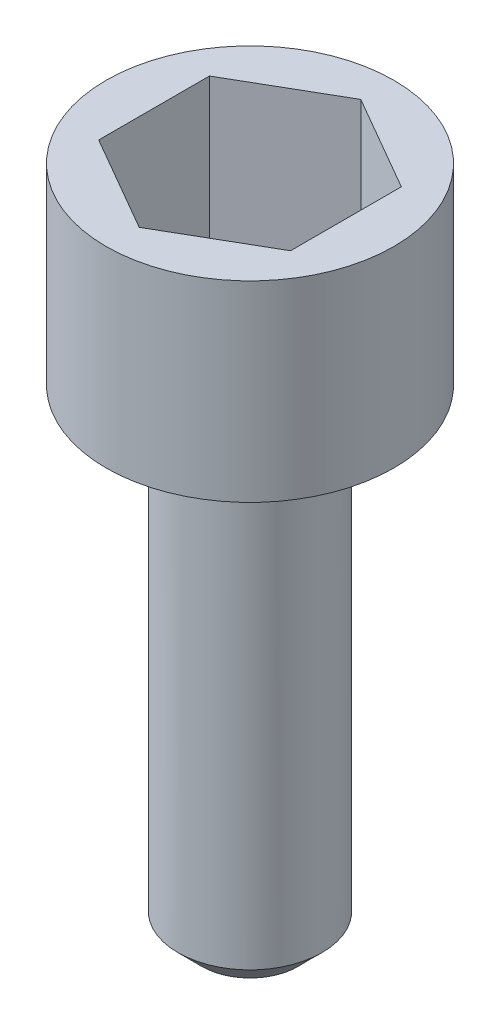
ISO-10303-21;
HEADER;
FILE_DESCRIPTION(('STEP AP214'),'2;1');
FILE_NAME('part.step','',(''),(''),'','','');
FILE_SCHEMA(('AUTOMOTIVE_DESIGN { 1 0 10303 214 1 1 1 1 }'));
ENDSEC;
DATA;
#1=APPLICATION_CONTEXT('core data for automotive mechanical design processes');
#2=APPLICATION_PROTOCOL_DEFINITION('international standard','automotive_design',2000,#1);
#3=PRODUCT_CONTEXT('',#1,'mechanical');
#4=PRODUCT('Part','Part','',(#3));
#5=PRODUCT_RELATED_PRODUCT_CATEGORY('part','',(#4));
#6=PRODUCT_DEFINITION_FORMATION('','',#4);
#7=PRODUCT_DEFINITION_CONTEXT('part definition',#1,'design');
#8=PRODUCT_DEFINITION('design','',#6,#7);
#9=PRODUCT_DEFINITION_SHAPE('','',#8);
#10=(LENGTH_UNIT() NAMED_UNIT(*) SI_UNIT(.MILLI.,.METRE.));
#11=(NAMED_UNIT(*) PLANE_ANGLE_UNIT() SI_UNIT($,.RADIAN.));
#12=(NAMED_UNIT(*) SI_UNIT($,.STERADIAN.) SOLID_ANGLE_UNIT());
#13=UNCERTAINTY_MEASURE_WITH_UNIT(LENGTH_MEASURE(1.E-05),#10,'distance_accuracy_value','');
#14=(GEOMETRIC_REPRESENTATION_CONTEXT(3) GLOBAL_UNCERTAINTY_ASSIGNED_CONTEXT((#13)) GLOBAL_UNIT_ASSIGNED_CONTEXT((#10,
#11,#12)) REPRESENTATION_CONTEXT('',''));
#15=CARTESIAN_POINT('',(0.,0.,0.));
#16=DIRECTION('',(0.,0.,1.));
#17=DIRECTION('',(1.,0.,0.));
#18=AXIS2_PLACEMENT_3D('',#15,#16,#17);
#19=CARTESIAN_POINT('',(0.,14.,0.));
#20=DIRECTION('',(0.,-1.,0.));
#21=DIRECTION('',(0.,0.,-1.));
#22=AXIS2_PLACEMENT_3D('',#19,#20,#21);
#23=PLANE('',#22);
#24=DIRECTION('',(-0.866025403784439,0.,0.5));
#25=VECTOR('',#24,1.);
#26=CARTESIAN_POINT('',(0.,14.,-2.3094010767585));
#27=LINE('',#26,#25);
#28=CARTESIAN_POINT('',(0.,14.,-2.3094010767585));
#29=VERTEX_POINT('',#28);
#30=CARTESIAN_POINT('',(-2.,14.,-1.15470053837925));
#31=VERTEX_POINT('',#30);
#32=EDGE_CURVE('E122',#29,#31,#27,.T.);
#33=ORIENTED_EDGE('',*,*,#32,.F.);
#34=DIRECTION('',(-0.866025403784439,0.,-0.5));
#35=VECTOR('',#34,1.);
#36=CARTESIAN_POINT('',(2.,14.,-1.15470053837925));
#37=LINE('',#36,#35);
#38=CARTESIAN_POINT('',(2.,14.,-1.15470053837925));
#39=VERTEX_POINT('',#38);
#40=EDGE_CURVE('E48',#39,#29,#37,.T.);
#41=ORIENTED_EDGE('',*,*,#40,.F.);
#42=DIRECTION('',(0.,0.,-1.));
#43=VECTOR('',#42,1.);
#44=CARTESIAN_POINT('',(2.,14.,1.15470053837925));
#45=LINE('',#44,#43);
#46=CARTESIAN_POINT('',(2.,14.,1.15470053837925));
#47=VERTEX_POINT('',#46);
#48=EDGE_CURVE('E131',#47,#39,#45,.T.);
#49=ORIENTED_EDGE('',*,*,#48,.F.);
#50=DIRECTION('',(0.866025403784439,0.,-0.5));
#51=VECTOR('',#50,1.);
#52=CARTESIAN_POINT('',(0.,14.,2.3094010767585));
#53=LINE('',#52,#51);
#54=CARTESIAN_POINT('',(0.,14.,2.3094010767585));
#55=VERTEX_POINT('',#54);
#56=EDGE_CURVE('E129',#55,#47,#53,.T.);
#57=ORIENTED_EDGE('',*,*,#56,.F.);
#58=DIRECTION('',(0.866025403784438,0.,0.5));
#59=VECTOR('',#58,1.);
#60=CARTESIAN_POINT('',(-2.,14.,1.15470053837925));
#61=LINE('',#60,#59);
#62=CARTESIAN_POINT('',(-2.,14.,1.15470053837925));
#63=VERTEX_POINT('',#62);
#64=EDGE_CURVE('E96',#63,#55,#61,.T.);
#65=ORIENTED_EDGE('',*,*,#64,.F.);
#66=DIRECTION('',(0.,0.,1.));
#67=VECTOR('',#66,1.);
#68=CARTESIAN_POINT('',(-2.,14.,-1.15470053837925));
#69=LINE('',#68,#67);
#70=EDGE_CURVE('E125',#31,#63,#69,.T.);
#71=ORIENTED_EDGE('',*,*,#70,.F.);
#72=EDGE_LOOP('',(#33,#41,#49,#57,#65,#71));
#73=FACE_BOUND('',#72,.T.);
#74=CARTESIAN_POINT('',(0.,14.,0.));
#75=DIRECTION('',(0.,-1.,0.));
#76=DIRECTION('',(0.,0.,-1.));
#77=AXIS2_PLACEMENT_3D('',#74,#75,#76);
#78=CIRCLE('',#77,3.);
#79=CARTESIAN_POINT('',(0.,14.,-3.));
#80=VERTEX_POINT('',#79);
#81=EDGE_CURVE('E146',#80,#80,#78,.T.);
#82=ORIENTED_EDGE('',*,*,#81,.F.);
#83=EDGE_LOOP('',(#82));
#84=FACE_BOUND('',#83,.T.);
#85=ADVANCED_FACE('F33',(#73,#84),#23,.F.);
#86=CARTESIAN_POINT('',(0.,0.,0.));
#87=DIRECTION('',(0.,-1.,0.));
#88=DIRECTION('',(0.,0.,-1.));
#89=AXIS2_PLACEMENT_3D('',#86,#87,#88);
#90=CYLINDRICAL_SURFACE('',#89,3.);
#91=CARTESIAN_POINT('',(0.,10.,0.));
#92=DIRECTION('',(0.,-1.,0.));
#93=DIRECTION('',(0.,0.,-1.));
#94=AXIS2_PLACEMENT_3D('',#91,#92,#93);
#95=CIRCLE('',#94,3.);
#96=CARTESIAN_POINT('',(0.,10.,-3.));
#97=VERTEX_POINT('',#96);
#98=EDGE_CURVE('E143',#97,#97,#95,.T.);
#99=ORIENTED_EDGE('',*,*,#98,.F.);
#100=EDGE_LOOP('',(#99));
#101=FACE_BOUND('',#100,.T.);
#102=ORIENTED_EDGE('',*,*,#81,.T.);
#103=EDGE_LOOP('',(#102));
#104=FACE_BOUND('',#103,.T.);
#105=ADVANCED_FACE('F162',(#101,#104),#90,.T.);
#106=CARTESIAN_POINT('',(-3.,10.,0.));
#107=DIRECTION('',(0.,1.,0.));
#108=DIRECTION('',(0.,0.,1.));
#109=AXIS2_PLACEMENT_3D('',#106,#107,#108);
#110=PLANE('',#109);
#111=CARTESIAN_POINT('',(0.,10.,0.));
#112=DIRECTION('',(0.,-1.,0.));
#113=DIRECTION('',(0.,0.,-1.));
#114=AXIS2_PLACEMENT_3D('',#111,#112,#113);
#115=CIRCLE('',#114,1.5);
#116=CARTESIAN_POINT('',(0.,10.,-1.5));
#117=VERTEX_POINT('',#116);
#118=EDGE_CURVE('E135',#117,#117,#115,.T.);
#119=ORIENTED_EDGE('',*,*,#118,.F.);
#120=EDGE_LOOP('',(#119));
#121=FACE_BOUND('',#120,.T.);
#122=ORIENTED_EDGE('',*,*,#98,.T.);
#123=EDGE_LOOP('',(#122));
#124=FACE_BOUND('',#123,.T.);
#125=ADVANCED_FACE('F167',(#121,#124),#110,.F.);
#126=CARTESIAN_POINT('',(0.,0.,0.));
#127=DIRECTION('',(0.,-1.,0.));
#128=DIRECTION('',(0.,0.,-1.));
#129=AXIS2_PLACEMENT_3D('',#126,#127,#128);
#130=CYLINDRICAL_SURFACE('',#129,1.5);
#131=CARTESIAN_POINT('',(0.,0.499999999999996,0.));
#132=DIRECTION('',(0.,1.,0.));
#133=DIRECTION('',(0.,0.,1.));
#134=AXIS2_PLACEMENT_3D('',#131,#132,#133);
#135=CIRCLE('',#134,1.5);
#136=CARTESIAN_POINT('',(0.,0.499999999999996,1.5));
#137=VERTEX_POINT('',#136);
#138=EDGE_CURVE('E11',#137,#137,#135,.T.);
#139=ORIENTED_EDGE('',*,*,#138,.T.);
#140=EDGE_LOOP('',(#139));
#141=FACE_BOUND('',#140,.T.);
#142=ORIENTED_EDGE('',*,*,#118,.T.);
#143=EDGE_LOOP('',(#142));
#144=FACE_BOUND('',#143,.T.);
#145=ADVANCED_FACE('F175',(#141,#144),#130,.T.);
#146=CARTESIAN_POINT('',(-1.5,0.,0.));
#147=DIRECTION('',(0.,1.,0.));
#148=DIRECTION('',(0.,0.,1.));
#149=AXIS2_PLACEMENT_3D('',#146,#147,#148);
#150=PLANE('',#149);
#151=CARTESIAN_POINT('',(0.,0.,0.));
#152=DIRECTION('',(0.,1.,0.));
#153=DIRECTION('',(0.,0.,1.));
#154=AXIS2_PLACEMENT_3D('',#151,#152,#153);
#155=CIRCLE('',#154,1.);
#156=CARTESIAN_POINT('',(0.,0.,1.));
#157=VERTEX_POINT('',#156);
#158=EDGE_CURVE('E41',#157,#157,#155,.F.);
#159=ORIENTED_EDGE('',*,*,#158,.T.);
#160=EDGE_LOOP('',(#159));
#161=FACE_BOUND('',#160,.T.);
#162=ADVANCED_FACE('F151',(#161),#150,.F.);
#163=CARTESIAN_POINT('',(2.,11.,-1.15470053837925));
#164=DIRECTION('',(0.5,0.,-0.866025403784438));
#165=DIRECTION('',(-0.866025403784439,0.,-0.5));
#166=AXIS2_PLACEMENT_3D('',#163,#164,#165);
#167=PLANE('',#166);
#168=ORIENTED_EDGE('',*,*,#40,.T.);
#169=DIRECTION('',(0.,1.,0.));
#170=VECTOR('',#169,1.);
#171=CARTESIAN_POINT('',(0.,11.,-2.3094010767585));
#172=LINE('',#171,#170);
#173=CARTESIAN_POINT('',(0.,11.,-2.3094010767585));
#174=VERTEX_POINT('',#173);
#175=EDGE_CURVE('E78',#174,#29,#172,.T.);
#176=ORIENTED_EDGE('',*,*,#175,.F.);
#177=DIRECTION('',(-0.866025403784439,0.,-0.5));
#178=VECTOR('',#177,1.);
#179=CARTESIAN_POINT('',(2.,11.,-1.15470053837925));
#180=LINE('',#179,#178);
#181=CARTESIAN_POINT('',(2.,11.,-1.15470053837925));
#182=VERTEX_POINT('',#181);
#183=EDGE_CURVE('E133',#182,#174,#180,.T.);
#184=ORIENTED_EDGE('',*,*,#183,.F.);
#185=DIRECTION('',(0.,1.,0.));
#186=VECTOR('',#185,1.);
#187=CARTESIAN_POINT('',(2.,11.,-1.15470053837925));
#188=LINE('',#187,#186);
#189=EDGE_CURVE('E56',#182,#39,#188,.T.);
#190=ORIENTED_EDGE('',*,*,#189,.T.);
#191=EDGE_LOOP('',(#168,#176,#184,#190));
#192=FACE_BOUND('',#191,.T.);
#193=ADVANCED_FACE('F182',(#192),#167,.F.);
#194=CARTESIAN_POINT('',(2.,11.,1.15470053837925));
#195=DIRECTION('',(1.,0.,0.));
#196=DIRECTION('',(0.,0.,-1.));
#197=AXIS2_PLACEMENT_3D('',#194,#195,#196);
#198=PLANE('',#197);
#199=ORIENTED_EDGE('',*,*,#48,.T.);
#200=ORIENTED_EDGE('',*,*,#189,.F.);
#201=DIRECTION('',(0.,0.,-1.));
#202=VECTOR('',#201,1.);
#203=CARTESIAN_POINT('',(2.,11.,1.15470053837925));
#204=LINE('',#203,#202);
#205=CARTESIAN_POINT('',(2.,11.,1.15470053837925));
#206=VERTEX_POINT('',#205);
#207=EDGE_CURVE('E108',#206,#182,#204,.T.);
#208=ORIENTED_EDGE('',*,*,#207,.F.);
#209=DIRECTION('',(0.,1.,0.));
#210=VECTOR('',#209,1.);
#211=CARTESIAN_POINT('',(2.,11.,1.15470053837925));
#212=LINE('',#211,#210);
#213=EDGE_CURVE('E100',#206,#47,#212,.T.);
#214=ORIENTED_EDGE('',*,*,#213,.T.);
#215=EDGE_LOOP('',(#199,#200,#208,#214));
#216=FACE_BOUND('',#215,.T.);
#217=ADVANCED_FACE('F185',(#216),#198,.F.);
#218=CARTESIAN_POINT('',(0.,11.,2.3094010767585));
#219=DIRECTION('',(0.5,0.,0.866025403784439));
#220=DIRECTION('',(0.866025403784439,0.,-0.5));
#221=AXIS2_PLACEMENT_3D('',#218,#219,#220);
#222=PLANE('',#221);
#223=ORIENTED_EDGE('',*,*,#56,.T.);
#224=ORIENTED_EDGE('',*,*,#213,.F.);
#225=DIRECTION('',(0.866025403784439,0.,-0.5));
#226=VECTOR('',#225,1.);
#227=CARTESIAN_POINT('',(0.,11.,2.3094010767585));
#228=LINE('',#227,#226);
#229=CARTESIAN_POINT('',(0.,11.,2.3094010767585));
#230=VERTEX_POINT('',#229);
#231=EDGE_CURVE('E104',#230,#206,#228,.T.);
#232=ORIENTED_EDGE('',*,*,#231,.F.);
#233=DIRECTION('',(0.,1.,0.));
#234=VECTOR('',#233,1.);
#235=CARTESIAN_POINT('',(0.,11.,2.3094010767585));
#236=LINE('',#235,#234);
#237=EDGE_CURVE('E89',#230,#55,#236,.T.);
#238=ORIENTED_EDGE('',*,*,#237,.T.);
#239=EDGE_LOOP('',(#223,#224,#232,#238));
#240=FACE_BOUND('',#239,.T.);
#241=ADVANCED_FACE('F105',(#240),#222,.F.);
#242=CARTESIAN_POINT('',(-2.,11.,1.15470053837925));
#243=DIRECTION('',(-0.5,0.,0.866025403784439));
#244=DIRECTION('',(0.866025403784439,0.,0.5));
#245=AXIS2_PLACEMENT_3D('',#242,#243,#244);
#246=PLANE('',#245);
#247=ORIENTED_EDGE('',*,*,#64,.T.);
#248=ORIENTED_EDGE('',*,*,#237,.F.);
#249=DIRECTION('',(0.866025403784438,0.,0.5));
#250=VECTOR('',#249,1.);
#251=CARTESIAN_POINT('',(-2.,11.,1.15470053837925));
#252=LINE('',#251,#250);
#253=CARTESIAN_POINT('',(-2.,11.,1.15470053837925));
#254=VERTEX_POINT('',#253);
#255=EDGE_CURVE('E93',#254,#230,#252,.T.);
#256=ORIENTED_EDGE('',*,*,#255,.F.);
#257=DIRECTION('',(0.,1.,0.));
#258=VECTOR('',#257,1.);
#259=CARTESIAN_POINT('',(-2.,11.,1.15470053837925));
#260=LINE('',#259,#258);
#261=EDGE_CURVE('E101',#254,#63,#260,.T.);
#262=ORIENTED_EDGE('',*,*,#261,.T.);
#263=EDGE_LOOP('',(#247,#248,#256,#262));
#264=FACE_BOUND('',#263,.T.);
#265=ADVANCED_FACE('F91',(#264),#246,.F.);
#266=CARTESIAN_POINT('',(-2.,11.,-1.15470053837925));
#267=DIRECTION('',(-1.,0.,0.));
#268=DIRECTION('',(0.,-1.,0.));
#269=AXIS2_PLACEMENT_3D('',#266,#267,#268);
#270=PLANE('',#269);
#271=ORIENTED_EDGE('',*,*,#70,.T.);
#272=ORIENTED_EDGE('',*,*,#261,.F.);
#273=DIRECTION('',(0.,0.,1.));
#274=VECTOR('',#273,1.);
#275=CARTESIAN_POINT('',(-2.,11.,-1.15470053837925));
#276=LINE('',#275,#274);
#277=CARTESIAN_POINT('',(-2.,11.,-1.15470053837925));
#278=VERTEX_POINT('',#277);
#279=EDGE_CURVE('E114',#278,#254,#276,.T.);
#280=ORIENTED_EDGE('',*,*,#279,.F.);
#281=DIRECTION('',(0.,1.,0.));
#282=VECTOR('',#281,1.);
#283=CARTESIAN_POINT('',(-2.,11.,-1.15470053837925));
#284=LINE('',#283,#282);
#285=EDGE_CURVE('E138',#278,#31,#284,.T.);
#286=ORIENTED_EDGE('',*,*,#285,.T.);
#287=EDGE_LOOP('',(#271,#272,#280,#286));
#288=FACE_BOUND('',#287,.T.);
#289=ADVANCED_FACE('F188',(#288),#270,.F.);
#290=CARTESIAN_POINT('',(0.,11.,-2.3094010767585));
#291=DIRECTION('',(-0.5,0.,-0.866025403784439));
#292=DIRECTION('',(-0.866025403784439,0.,0.5));
#293=AXIS2_PLACEMENT_3D('',#290,#291,#292);
#294=PLANE('',#293);
#295=ORIENTED_EDGE('',*,*,#32,.T.);
#296=ORIENTED_EDGE('',*,*,#285,.F.);
#297=DIRECTION('',(-0.866025403784439,0.,0.5));
#298=VECTOR('',#297,1.);
#299=CARTESIAN_POINT('',(0.,11.,-2.3094010767585));
#300=LINE('',#299,#298);
#301=EDGE_CURVE('E116',#174,#278,#300,.T.);
#302=ORIENTED_EDGE('',*,*,#301,.F.);
#303=ORIENTED_EDGE('',*,*,#175,.T.);
#304=EDGE_LOOP('',(#295,#296,#302,#303));
#305=FACE_BOUND('',#304,.T.);
#306=ADVANCED_FACE('F158',(#305),#294,.F.);
#307=CARTESIAN_POINT('',(0.,11.,0.));
#308=DIRECTION('',(0.,1.,0.));
#309=DIRECTION('',(0.,0.,1.));
#310=AXIS2_PLACEMENT_3D('',#307,#308,#309);
#311=PLANE('',#310);
#312=ORIENTED_EDGE('',*,*,#183,.T.);
#313=ORIENTED_EDGE('',*,*,#301,.T.);
#314=ORIENTED_EDGE('',*,*,#279,.T.);
#315=ORIENTED_EDGE('',*,*,#255,.T.);
#316=ORIENTED_EDGE('',*,*,#231,.T.);
#317=ORIENTED_EDGE('',*,*,#207,.T.);
#318=EDGE_LOOP('',(#312,#313,#314,#315,#316,#317));
#319=FACE_BOUND('',#318,.T.);
#320=ADVANCED_FACE('F111',(#319),#311,.T.);
#321=CARTESIAN_POINT('',(0.,0.,0.));
#322=DIRECTION('',(0.,1.,0.));
#323=DIRECTION('',(0.,0.,1.));
#324=AXIS2_PLACEMENT_3D('',#321,#322,#323);
#325=CONICAL_SURFACE('',#324,1.,0.785398163397448);
#326=ORIENTED_EDGE('',*,*,#138,.F.);
#327=EDGE_LOOP('',(#326));
#328=FACE_BOUND('',#327,.T.);
#329=ORIENTED_EDGE('',*,*,#158,.F.);
#330=EDGE_LOOP('',(#329));
#331=FACE_BOUND('',#330,.T.);
#332=ADVANCED_FACE('F35',(#328,#331),#325,.T.);
#333=CLOSED_SHELL('',(#85,#105,#125,#145,#162,#193,#217,#241,#265,#289,#306,#320,#332));
#334=MANIFOLD_SOLID_BREP('B2',#333);
#335=ADVANCED_BREP_SHAPE_REPRESENTATION('',(#18,#334),#14);
#336=SHAPE_DEFINITION_REPRESENTATION(#9,#335);
ENDSEC;
END-ISO-10303-21;
